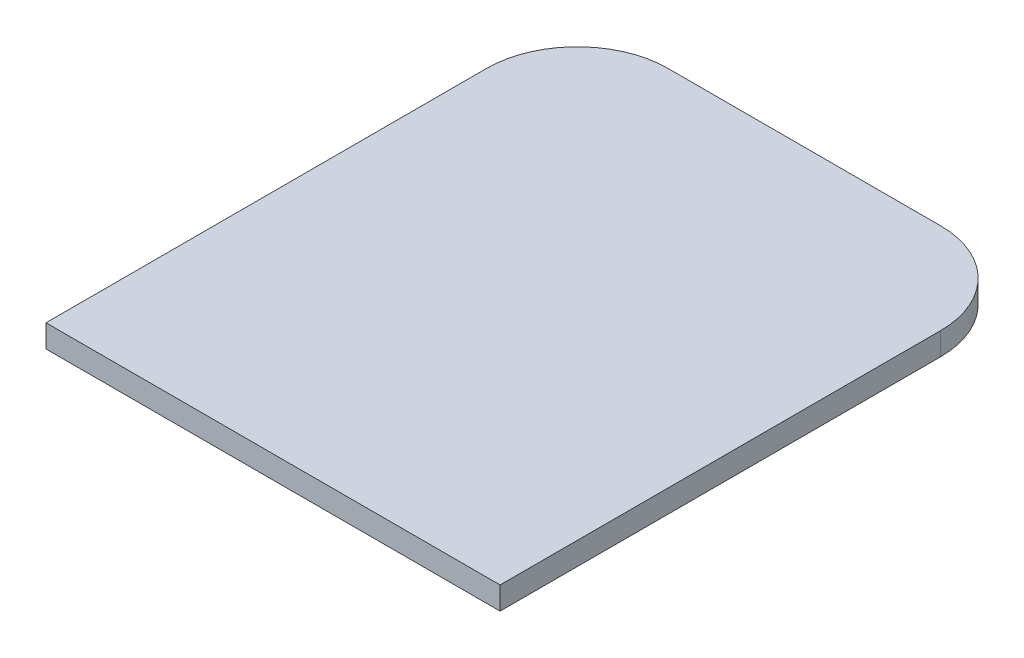
ISO-10303-21;
HEADER;
FILE_DESCRIPTION(('STEP AP214'),'2;1');
FILE_NAME('part.step','',(''),(''),'','','');
FILE_SCHEMA(('AUTOMOTIVE_DESIGN { 1 0 10303 214 1 1 1 1 }'));
ENDSEC;
DATA;
#1=APPLICATION_CONTEXT('core data for automotive mechanical design processes');
#2=APPLICATION_PROTOCOL_DEFINITION('international standard','automotive_design',2000,#1);
#3=PRODUCT_CONTEXT('',#1,'mechanical');
#4=PRODUCT('Part','Part','',(#3));
#5=PRODUCT_RELATED_PRODUCT_CATEGORY('part','',(#4));
#6=PRODUCT_DEFINITION_FORMATION('','',#4);
#7=PRODUCT_DEFINITION_CONTEXT('part definition',#1,'design');
#8=PRODUCT_DEFINITION('design','',#6,#7);
#9=PRODUCT_DEFINITION_SHAPE('','',#8);
#10=(LENGTH_UNIT() NAMED_UNIT(*) SI_UNIT(.MILLI.,.METRE.));
#11=(NAMED_UNIT(*) PLANE_ANGLE_UNIT() SI_UNIT($,.RADIAN.));
#12=(NAMED_UNIT(*) SI_UNIT($,.STERADIAN.) SOLID_ANGLE_UNIT());
#13=UNCERTAINTY_MEASURE_WITH_UNIT(LENGTH_MEASURE(1.E-05),#10,'distance_accuracy_value','');
#14=(GEOMETRIC_REPRESENTATION_CONTEXT(3) GLOBAL_UNCERTAINTY_ASSIGNED_CONTEXT((#13)) GLOBAL_UNIT_ASSIGNED_CONTEXT((#10,
#11,#12)) REPRESENTATION_CONTEXT('',''));
#15=CARTESIAN_POINT('',(0.,0.,0.));
#16=DIRECTION('',(0.,0.,1.));
#17=DIRECTION('',(1.,0.,0.));
#18=AXIS2_PLACEMENT_3D('',#15,#16,#17);
#19=CARTESIAN_POINT('',(0.,1.,0.));
#20=DIRECTION('',(-1.,0.,0.));
#21=DIRECTION('',(0.,0.,1.));
#22=AXIS2_PLACEMENT_3D('',#19,#20,#21);
#23=PLANE('',#22);
#24=DIRECTION('',(0.,0.,-1.));
#25=VECTOR('',#24,1.);
#26=CARTESIAN_POINT('',(0.,0.,0.));
#27=LINE('',#26,#25);
#28=CARTESIAN_POINT('',(0.,0.,0.));
#29=VERTEX_POINT('',#28);
#30=CARTESIAN_POINT('',(0.,0.,-19.4));
#31=VERTEX_POINT('',#30);
#32=EDGE_CURVE('E121',#29,#31,#27,.T.);
#33=ORIENTED_EDGE('',*,*,#32,.T.);
#34=DIRECTION('',(0.,-1.,0.));
#35=VECTOR('',#34,1.);
#36=CARTESIAN_POINT('',(0.,1.,-19.4));
#37=LINE('',#36,#35);
#38=CARTESIAN_POINT('',(0.,1.,-19.4));
#39=VERTEX_POINT('',#38);
#40=EDGE_CURVE('E11',#39,#31,#37,.T.);
#41=ORIENTED_EDGE('',*,*,#40,.F.);
#42=DIRECTION('',(0.,0.,-1.));
#43=VECTOR('',#42,1.);
#44=CARTESIAN_POINT('',(0.,1.,0.));
#45=LINE('',#44,#43);
#46=CARTESIAN_POINT('',(0.,1.,0.));
#47=VERTEX_POINT('',#46);
#48=EDGE_CURVE('E133',#47,#39,#45,.T.);
#49=ORIENTED_EDGE('',*,*,#48,.F.);
#50=DIRECTION('',(0.,-1.,0.));
#51=VECTOR('',#50,1.);
#52=CARTESIAN_POINT('',(0.,1.,0.));
#53=LINE('',#52,#51);
#54=EDGE_CURVE('E118',#47,#29,#53,.T.);
#55=ORIENTED_EDGE('',*,*,#54,.T.);
#56=EDGE_LOOP('',(#33,#41,#49,#55));
#57=FACE_BOUND('',#56,.T.);
#58=ADVANCED_FACE('F39',(#57),#23,.F.);
#59=CARTESIAN_POINT('',(-4.,1.,-19.4));
#60=DIRECTION('',(0.,-1.,0.));
#61=DIRECTION('',(0.,0.,-1.));
#62=AXIS2_PLACEMENT_3D('',#59,#60,#61);
#63=CYLINDRICAL_SURFACE('',#62,4.);
#64=CARTESIAN_POINT('',(-4.,0.,-19.4));
#65=DIRECTION('',(0.,1.,0.));
#66=DIRECTION('',(0.,0.,1.));
#67=AXIS2_PLACEMENT_3D('',#64,#65,#66);
#68=CIRCLE('',#67,4.);
#69=CARTESIAN_POINT('',(-4.00000000000003,0.,-23.4));
#70=VERTEX_POINT('',#69);
#71=EDGE_CURVE('E128',#31,#70,#68,.T.);
#72=ORIENTED_EDGE('',*,*,#71,.T.);
#73=DIRECTION('',(0.,-1.,0.));
#74=VECTOR('',#73,1.);
#75=CARTESIAN_POINT('',(-4.00000000000003,1.,-23.4));
#76=LINE('',#75,#74);
#77=CARTESIAN_POINT('',(-4.00000000000003,1.,-23.4));
#78=VERTEX_POINT('',#77);
#79=EDGE_CURVE('E50',#78,#70,#76,.T.);
#80=ORIENTED_EDGE('',*,*,#79,.F.);
#81=CARTESIAN_POINT('',(-4.,1.,-19.4));
#82=DIRECTION('',(0.,1.,0.));
#83=DIRECTION('',(0.,0.,1.));
#84=AXIS2_PLACEMENT_3D('',#81,#82,#83);
#85=CIRCLE('',#84,4.);
#86=EDGE_CURVE('E95',#39,#78,#85,.T.);
#87=ORIENTED_EDGE('',*,*,#86,.F.);
#88=ORIENTED_EDGE('',*,*,#40,.T.);
#89=EDGE_LOOP('',(#72,#80,#87,#88));
#90=FACE_BOUND('',#89,.T.);
#91=ADVANCED_FACE('F160',(#90),#63,.T.);
#92=CARTESIAN_POINT('',(-4.00000000000003,1.,-23.4));
#93=DIRECTION('',(0.,0.,1.));
#94=DIRECTION('',(1.,0.,0.));
#95=AXIS2_PLACEMENT_3D('',#92,#93,#94);
#96=PLANE('',#95);
#97=DIRECTION('',(-1.,0.,0.));
#98=VECTOR('',#97,1.);
#99=CARTESIAN_POINT('',(-4.00000000000003,0.,-23.4));
#100=LINE('',#99,#98);
#101=CARTESIAN_POINT('',(-16.,0.,-23.4));
#102=VERTEX_POINT('',#101);
#103=EDGE_CURVE('E126',#70,#102,#100,.T.);
#104=ORIENTED_EDGE('',*,*,#103,.T.);
#105=DIRECTION('',(0.,-1.,0.));
#106=VECTOR('',#105,1.);
#107=CARTESIAN_POINT('',(-16.,1.,-23.4));
#108=LINE('',#107,#106);
#109=CARTESIAN_POINT('',(-16.,1.,-23.4));
#110=VERTEX_POINT('',#109);
#111=EDGE_CURVE('E114',#110,#102,#108,.T.);
#112=ORIENTED_EDGE('',*,*,#111,.F.);
#113=DIRECTION('',(-1.,0.,0.));
#114=VECTOR('',#113,1.);
#115=CARTESIAN_POINT('',(-4.00000000000003,1.,-23.4));
#116=LINE('',#115,#114);
#117=EDGE_CURVE('E103',#78,#110,#116,.T.);
#118=ORIENTED_EDGE('',*,*,#117,.F.);
#119=ORIENTED_EDGE('',*,*,#79,.T.);
#120=EDGE_LOOP('',(#104,#112,#118,#119));
#121=FACE_BOUND('',#120,.T.);
#122=ADVANCED_FACE('F137',(#121),#96,.F.);
#123=CARTESIAN_POINT('',(-16.,1.,-19.4));
#124=DIRECTION('',(0.,-1.,0.));
#125=DIRECTION('',(0.,0.,-1.));
#126=AXIS2_PLACEMENT_3D('',#123,#124,#125);
#127=CYLINDRICAL_SURFACE('',#126,4.);
#128=CARTESIAN_POINT('',(-16.,0.,-19.4));
#129=DIRECTION('',(0.,1.,0.));
#130=DIRECTION('',(0.,0.,-1.));
#131=AXIS2_PLACEMENT_3D('',#128,#129,#130);
#132=CIRCLE('',#131,4.);
#133=CARTESIAN_POINT('',(-20.,0.,-19.4));
#134=VERTEX_POINT('',#133);
#135=EDGE_CURVE('E111',#102,#134,#132,.T.);
#136=ORIENTED_EDGE('',*,*,#135,.T.);
#137=DIRECTION('',(0.,-1.,0.));
#138=VECTOR('',#137,1.);
#139=CARTESIAN_POINT('',(-20.,1.,-19.4));
#140=LINE('',#139,#138);
#141=CARTESIAN_POINT('',(-20.,1.,-19.4));
#142=VERTEX_POINT('',#141);
#143=EDGE_CURVE('E110',#142,#134,#140,.T.);
#144=ORIENTED_EDGE('',*,*,#143,.F.);
#145=CARTESIAN_POINT('',(-16.,1.,-19.4));
#146=DIRECTION('',(0.,1.,0.));
#147=DIRECTION('',(0.,0.,-1.));
#148=AXIS2_PLACEMENT_3D('',#145,#146,#147);
#149=CIRCLE('',#148,4.);
#150=EDGE_CURVE('E98',#110,#142,#149,.T.);
#151=ORIENTED_EDGE('',*,*,#150,.F.);
#152=ORIENTED_EDGE('',*,*,#111,.T.);
#153=EDGE_LOOP('',(#136,#144,#151,#152));
#154=FACE_BOUND('',#153,.T.);
#155=ADVANCED_FACE('F112',(#154),#127,.T.);
#156=CARTESIAN_POINT('',(-20.,1.,0.));
#157=DIRECTION('',(1.,0.,0.));
#158=DIRECTION('',(0.,0.,-1.));
#159=AXIS2_PLACEMENT_3D('',#156,#157,#158);
#160=PLANE('',#159);
#161=DIRECTION('',(0.,0.,1.));
#162=VECTOR('',#161,1.);
#163=CARTESIAN_POINT('',(-20.,0.,0.));
#164=LINE('',#163,#162);
#165=CARTESIAN_POINT('',(-20.,0.,0.));
#166=VERTEX_POINT('',#165);
#167=EDGE_CURVE('E76',#134,#166,#164,.T.);
#168=ORIENTED_EDGE('',*,*,#167,.T.);
#169=DIRECTION('',(0.,-1.,0.));
#170=VECTOR('',#169,1.);
#171=CARTESIAN_POINT('',(-20.,1.,0.));
#172=LINE('',#171,#170);
#173=CARTESIAN_POINT('',(-20.,1.,0.));
#174=VERTEX_POINT('',#173);
#175=EDGE_CURVE('E113',#174,#166,#172,.T.);
#176=ORIENTED_EDGE('',*,*,#175,.F.);
#177=DIRECTION('',(0.,0.,1.));
#178=VECTOR('',#177,1.);
#179=CARTESIAN_POINT('',(-20.,1.,0.));
#180=LINE('',#179,#178);
#181=EDGE_CURVE('E104',#142,#174,#180,.T.);
#182=ORIENTED_EDGE('',*,*,#181,.F.);
#183=ORIENTED_EDGE('',*,*,#143,.T.);
#184=EDGE_LOOP('',(#168,#176,#182,#183));
#185=FACE_BOUND('',#184,.T.);
#186=ADVANCED_FACE('F117',(#185),#160,.F.);
#187=CARTESIAN_POINT('',(0.,1.,0.));
#188=DIRECTION('',(0.,0.,-1.));
#189=DIRECTION('',(-1.,0.,0.));
#190=AXIS2_PLACEMENT_3D('',#187,#188,#189);
#191=PLANE('',#190);
#192=DIRECTION('',(1.,0.,0.));
#193=VECTOR('',#192,1.);
#194=CARTESIAN_POINT('',(0.,0.,0.));
#195=LINE('',#194,#193);
#196=EDGE_CURVE('E84',#166,#29,#195,.T.);
#197=ORIENTED_EDGE('',*,*,#196,.T.);
#198=ORIENTED_EDGE('',*,*,#54,.F.);
#199=DIRECTION('',(1.,0.,0.));
#200=VECTOR('',#199,1.);
#201=CARTESIAN_POINT('',(0.,1.,0.));
#202=LINE('',#201,#200);
#203=EDGE_CURVE('E54',#174,#47,#202,.T.);
#204=ORIENTED_EDGE('',*,*,#203,.F.);
#205=ORIENTED_EDGE('',*,*,#175,.T.);
#206=EDGE_LOOP('',(#197,#198,#204,#205));
#207=FACE_BOUND('',#206,.T.);
#208=ADVANCED_FACE('F147',(#207),#191,.F.);
#209=CARTESIAN_POINT('',(-4.,1.,-19.4));
#210=DIRECTION('',(0.,1.,0.));
#211=DIRECTION('',(0.,0.,1.));
#212=AXIS2_PLACEMENT_3D('',#209,#210,#211);
#213=PLANE('',#212);
#214=ORIENTED_EDGE('',*,*,#48,.T.);
#215=ORIENTED_EDGE('',*,*,#86,.T.);
#216=ORIENTED_EDGE('',*,*,#117,.T.);
#217=ORIENTED_EDGE('',*,*,#150,.T.);
#218=ORIENTED_EDGE('',*,*,#181,.T.);
#219=ORIENTED_EDGE('',*,*,#203,.T.);
#220=EDGE_LOOP('',(#214,#215,#216,#217,#218,#219));
#221=FACE_BOUND('',#220,.T.);
#222=ADVANCED_FACE('F102',(#221),#213,.T.);
#223=CARTESIAN_POINT('',(-4.,0.,-19.4));
#224=DIRECTION('',(0.,1.,0.));
#225=DIRECTION('',(0.,0.,1.));
#226=AXIS2_PLACEMENT_3D('',#223,#224,#225);
#227=PLANE('',#226);
#228=ORIENTED_EDGE('',*,*,#32,.F.);
#229=ORIENTED_EDGE('',*,*,#196,.F.);
#230=ORIENTED_EDGE('',*,*,#167,.F.);
#231=ORIENTED_EDGE('',*,*,#135,.F.);
#232=ORIENTED_EDGE('',*,*,#103,.F.);
#233=ORIENTED_EDGE('',*,*,#71,.F.);
#234=EDGE_LOOP('',(#228,#229,#230,#231,#232,#233));
#235=FACE_BOUND('',#234,.T.);
#236=ADVANCED_FACE('F145',(#235),#227,.F.);
#237=CLOSED_SHELL('',(#58,#91,#122,#155,#186,#208,#222,#236));
#238=MANIFOLD_SOLID_BREP('B2',#237);
#239=ADVANCED_BREP_SHAPE_REPRESENTATION('',(#18,#238),#14);
#240=SHAPE_DEFINITION_REPRESENTATION(#9,#239);
ENDSEC;
END-ISO-10303-21;
